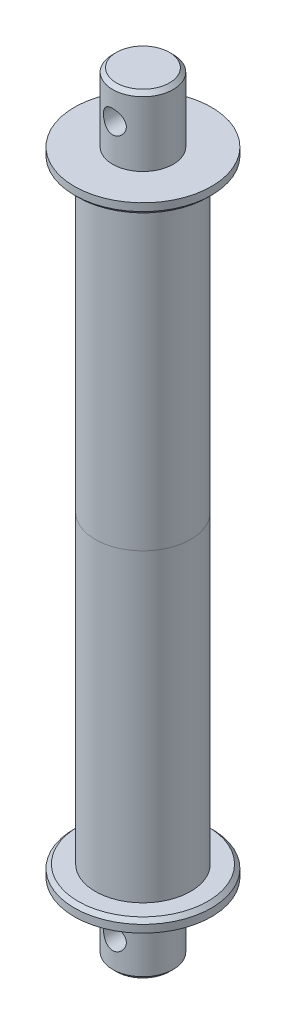
ISO-10303-21;
HEADER;
FILE_DESCRIPTION(('STEP AP214'),'2;1');
FILE_NAME('part.step','',(''),(''),'','','');
FILE_SCHEMA(('AUTOMOTIVE_DESIGN { 1 0 10303 214 1 1 1 1 }'));
ENDSEC;
DATA;
#1=APPLICATION_CONTEXT('core data for automotive mechanical design processes');
#2=APPLICATION_PROTOCOL_DEFINITION('international standard','automotive_design',2000,#1);
#3=PRODUCT_CONTEXT('',#1,'mechanical');
#4=PRODUCT('Part','Part','',(#3));
#5=PRODUCT_RELATED_PRODUCT_CATEGORY('part','',(#4));
#6=PRODUCT_DEFINITION_FORMATION('','',#4);
#7=PRODUCT_DEFINITION_CONTEXT('part definition',#1,'design');
#8=PRODUCT_DEFINITION('design','',#6,#7);
#9=PRODUCT_DEFINITION_SHAPE('','',#8);
#10=(LENGTH_UNIT() NAMED_UNIT(*) SI_UNIT(.MILLI.,.METRE.));
#11=(NAMED_UNIT(*) PLANE_ANGLE_UNIT() SI_UNIT($,.RADIAN.));
#12=(NAMED_UNIT(*) SI_UNIT($,.STERADIAN.) SOLID_ANGLE_UNIT());
#13=UNCERTAINTY_MEASURE_WITH_UNIT(LENGTH_MEASURE(1.E-05),#10,'distance_accuracy_value','');
#14=(GEOMETRIC_REPRESENTATION_CONTEXT(3) GLOBAL_UNCERTAINTY_ASSIGNED_CONTEXT((#13)) GLOBAL_UNIT_ASSIGNED_CONTEXT((#10,
#11,#12)) REPRESENTATION_CONTEXT('',''));
#15=CARTESIAN_POINT('',(0.,0.,0.));
#16=DIRECTION('',(0.,0.,1.));
#17=DIRECTION('',(1.,0.,0.));
#18=AXIS2_PLACEMENT_3D('',#15,#16,#17);
#19=CARTESIAN_POINT('',(0.,-184.,0.));
#20=DIRECTION('',(0.,1.,0.));
#21=DIRECTION('',(0.,0.,-1.));
#22=AXIS2_PLACEMENT_3D('',#19,#20,#21);
#23=CYLINDRICAL_SURFACE('',#22,7.95);
#24=CARTESIAN_POINT('',(0.,-178.7,-7.95));
#25=CARTESIAN_POINT('',(-0.162397491346748,-178.700006155822,-7.95000463305476));
#26=CARTESIAN_POINT('',(-0.324753099848184,-178.686772434708,-7.94498084128038));
#27=CARTESIAN_POINT('',(-0.644608276496747,-178.634404688573,-7.92544254710234));
#28=CARTESIAN_POINT('',(-0.802108607238702,-178.595274752861,-7.91092954315817));
#29=CARTESIAN_POINT('',(-1.10759384707584,-178.49269822242,-7.87396945860854));
#30=CARTESIAN_POINT('',(-1.25559660387505,-178.429298895846,-7.85153780728387));
#31=CARTESIAN_POINT('',(-1.53885384506537,-178.280225253955,-7.80097147100144));
#32=CARTESIAN_POINT('',(-1.67410485143574,-178.194544885329,-7.77283523668182));
#33=CARTESIAN_POINT('',(-1.93382546780256,-177.999501100852,-7.71241146666441));
#34=CARTESIAN_POINT('',(-2.05767538384718,-177.889349562112,-7.68000542519286));
#35=CARTESIAN_POINT('',(-2.28564512635347,-177.650163326245,-7.61527381268037));
#36=CARTESIAN_POINT('',(-2.38975880250598,-177.521122764952,-7.58294826981162));
#37=CARTESIAN_POINT('',(-2.57926636225751,-177.241737456099,-7.52065411531348));
#38=CARTESIAN_POINT('',(-2.6637805831916,-177.09076180509,-7.49082499932832));
#39=CARTESIAN_POINT('',(-2.80594178602416,-176.775437138237,-7.43874757327125));
#40=CARTESIAN_POINT('',(-2.86359965340992,-176.611093572494,-7.41649619275682));
#41=CARTESIAN_POINT('',(-2.94795796885628,-176.280834869077,-7.38336190811873));
#42=CARTESIAN_POINT('',(-2.97584212262489,-176.115266990026,-7.37204616258461));
#43=CARTESIAN_POINT('',(-3.00356228598173,-175.781445139854,-7.36079887492185));
#44=CARTESIAN_POINT('',(-3.00341006762253,-175.613192325772,-7.36086255474267));
#45=CARTESIAN_POINT('',(-2.97596618835097,-175.289655995893,-7.37199408836324));
#46=CARTESIAN_POINT('',(-2.95032311907401,-175.134205352635,-7.38239348387374));
#47=CARTESIAN_POINT('',(-2.87535300460385,-174.830002982662,-7.41191277552078));
#48=CARTESIAN_POINT('',(-2.82602234656689,-174.681252281612,-7.43103400189338));
#49=CARTESIAN_POINT('',(-2.70418189216197,-174.391334929297,-7.47624078591974));
#50=CARTESIAN_POINT('',(-2.6312480533409,-174.250366973954,-7.50245218680417));
#51=CARTESIAN_POINT('',(-2.4645673406646,-173.982194710485,-7.55884475137268));
#52=CARTESIAN_POINT('',(-2.37081321733859,-173.854995219441,-7.58902729628462));
#53=CARTESIAN_POINT('',(-2.15763402761746,-173.608854436917,-7.65246921492573));
#54=CARTESIAN_POINT('',(-2.03689525756286,-173.491066040375,-7.68579812115875));
#55=CARTESIAN_POINT('',(-1.77699753283556,-173.277063734313,-7.75001160096118));
#56=CARTESIAN_POINT('',(-1.63783568074396,-173.180853224796,-7.7808957888236));
#57=CARTESIAN_POINT('',(-1.34207116187379,-173.011444609312,-7.8373678710877));
#58=CARTESIAN_POINT('',(-1.18522721144045,-172.938635034876,-7.86286415320891));
#59=CARTESIAN_POINT('',(-0.860314702000954,-172.820819042114,-7.90500692503181));
#60=CARTESIAN_POINT('',(-0.692251231753703,-172.775800112654,-7.92165739657785));
#61=CARTESIAN_POINT('',(-0.359369733398544,-172.717070324382,-7.94353018166807));
#62=CARTESIAN_POINT('',(-0.19486250407749,-172.701807263327,-7.94931845634064));
#63=CARTESIAN_POINT('',(0.134445660228265,-172.698496926765,-7.95056675753456));
#64=CARTESIAN_POINT('',(0.299246520773489,-172.710443526443,-7.94602910839152));
#65=CARTESIAN_POINT('',(0.617726140759182,-172.760037038119,-7.92750856979343));
#66=CARTESIAN_POINT('',(0.771587980773985,-172.796663171383,-7.91390105530444));
#67=CARTESIAN_POINT('',(1.07087124221814,-172.893227896694,-7.87898797802321));
#68=CARTESIAN_POINT('',(1.21629156356081,-172.95316951938,-7.85768141450416));
#69=CARTESIAN_POINT('',(1.49937620417867,-173.096580931644,-7.8086891601555));
#70=CARTESIAN_POINT('',(1.63668485220482,-173.180693025988,-7.78083372768986));
#71=CARTESIAN_POINT('',(1.89570132393104,-173.369332962027,-7.7218192041405));
#72=CARTESIAN_POINT('',(2.01740330922294,-173.473868407347,-7.6906588846264));
#73=CARTESIAN_POINT('',(2.24923419609775,-173.707613859159,-7.62618977395529));
#74=CARTESIAN_POINT('',(2.35826281750801,-173.837912828914,-7.59286232939511));
#75=CARTESIAN_POINT('',(2.55312943709525,-174.115606919993,-7.52957881379437));
#76=CARTESIAN_POINT('',(2.6389652099205,-174.263003679909,-7.49962306642862));
#77=CARTESIAN_POINT('',(2.78513438407436,-174.572012098932,-7.44658528316189));
#78=CARTESIAN_POINT('',(2.84534845350868,-174.733686127761,-7.42353555585955));
#79=CARTESIAN_POINT('',(2.93729581964043,-175.065993510236,-7.38764350420071));
#80=CARTESIAN_POINT('',(2.96904704082561,-175.236621153564,-7.374794756358));
#81=CARTESIAN_POINT('',(3.00155503802499,-175.570053021797,-7.36161978142478));
#82=CARTESIAN_POINT('',(3.00419110375903,-175.7326455082,-7.36053436127972));
#83=CARTESIAN_POINT('',(2.98321973734043,-176.055827684246,-7.36905868877782));
#84=CARTESIAN_POINT('',(2.95961485946022,-176.216417567282,-7.37866739546335));
#85=CARTESIAN_POINT('',(2.88830176573362,-176.525929360605,-7.40686184253781));
#86=CARTESIAN_POINT('',(2.84137107510191,-176.675059147944,-7.42515720122094));
#87=CARTESIAN_POINT('',(2.72542723369111,-176.963412785519,-7.46849099490141));
#88=CARTESIAN_POINT('',(2.65640846747208,-177.102634105717,-7.49353114436682));
#89=CARTESIAN_POINT('',(2.4940127469099,-177.375226883347,-7.54918066261999));
#90=CARTESIAN_POINT('',(2.39954048534419,-177.50789940309,-7.58001455370614));
#91=CARTESIAN_POINT('',(2.19060617827199,-177.756108052509,-7.64301253026733));
#92=CARTESIAN_POINT('',(2.07613773887329,-177.871638679047,-7.67517703869663));
#93=CARTESIAN_POINT('',(1.82292686694646,-178.088775029515,-7.73934015838431));
#94=CARTESIAN_POINT('',(1.68319475235041,-178.189263396522,-7.7712320684291));
#95=CARTESIAN_POINT('',(1.38770505428976,-178.365304905216,-7.82939530273651));
#96=CARTESIAN_POINT('',(1.23194587961074,-178.440855567874,-7.85566606811619));
#97=CARTESIAN_POINT('',(0.900729443719504,-178.567331659402,-7.90065816243918));
#98=CARTESIAN_POINT('',(0.724682578706468,-178.616880634104,-7.91895015266806));
#99=CARTESIAN_POINT('',(0.365737044740326,-178.683202847218,-7.94361537532247));
#100=CARTESIAN_POINT('',(0.182841976353431,-178.699993069211,-7.94999478368242));
#101=CARTESIAN_POINT('',(0.,-178.7,-7.95));
#102=B_SPLINE_CURVE_WITH_KNOTS('',3,(#24,#25,#26,#27,#28,#29,#30,#31,#32,#33,#34,#35,#36,#37,
#38,#39,#40,#41,#42,#43,#44,#45,#46,#47,#48,#49,#50,#51,#52,#53,#54,#55,#56,#57,#58,#59,#60,#61,
#62,#63,#64,#65,#66,#67,#68,#69,#70,#71,#72,#73,#74,#75,#76,#77,#78,#79,#80,#81,#82,#83,#84,#85,
#86,#87,#88,#89,#90,#91,#92,#93,#94,#95,#96,#97,#98,#99,#100,#101),.UNSPECIFIED.,.T.,.F.,(4,2,2,
2,2,2,2,2,2,2,2,2,2,2,2,2,2,2,2,2,2,2,2,2,2,2,2,2,2,2,2,2,2,2,2,2,2,2,4),(0.,0.486517984474757,
0.972959160520784,1.45845770295972,1.94408828362444,2.44851024997545,2.95308914942897,
3.47718162143793,4.00106148167018,4.503234870572,5.00519740487303,5.47667849204094,
5.94823151260984,6.42877607760177,6.90948822777714,7.42294833461539,7.93648929004924,
8.45816227693259,8.97960023906362,9.4730216283662,9.96633196092749,10.4403977118492,
10.9145251042877,11.4026484582173,11.8909538882842,12.4079529144854,12.9250015290952,
13.4444325927827,13.9635363143255,14.4489214843418,14.9342594114916,15.4044069203738,
15.8746740496895,16.36981560475,16.8651157749309,17.3876947690209,17.9103256964684,
18.4583764326353,19.0061429595389),.UNSPECIFIED.);
#103=CARTESIAN_POINT('',(0.,-178.7,-7.95));
#104=VERTEX_POINT('',#103);
#105=EDGE_CURVE('E77',#104,#104,#102,.T.);
#106=ORIENTED_EDGE('',*,*,#105,.F.);
#107=EDGE_LOOP('',(#106));
#108=FACE_BOUND('',#107,.T.);
#109=CARTESIAN_POINT('',(3.,-175.7,7.36223471508482));
#110=CARTESIAN_POINT('',(2.99998847638603,-175.538180879128,7.36224526269351));
#111=CARTESIAN_POINT('',(2.9868408533845,-175.376210372287,7.36763957602915));
#112=CARTESIAN_POINT('',(2.93479898105657,-175.057258889964,7.38851783959743));
#113=CARTESIAN_POINT('',(2.89590575612689,-174.90027771622,7.40400138838714));
#114=CARTESIAN_POINT('',(2.79402781177854,-174.595869307248,7.44304061076884));
#115=CARTESIAN_POINT('',(2.731101471071,-174.448419925345,7.46657670963436));
#116=CARTESIAN_POINT('',(2.58314510981222,-174.166120814064,7.51904250584224));
#117=CARTESIAN_POINT('',(2.49810836153358,-174.031274936674,7.54797384408236));
#118=CARTESIAN_POINT('',(2.30376153242717,-173.77121232088,7.60960064181843));
#119=CARTESIAN_POINT('',(2.19351841745457,-173.646719044522,7.64240778971229));
#120=CARTESIAN_POINT('',(1.95386685111475,-173.417477058005,7.70715883050975));
#121=CARTESIAN_POINT('',(1.82445425584252,-173.31273262815,7.73910253499114));
#122=CARTESIAN_POINT('',(1.5446329927432,-173.122462950205,7.79985728918744));
#123=CARTESIAN_POINT('',(1.39365377203541,-173.037725922019,7.82852214322748));
#124=CARTESIAN_POINT('',(1.07830992462712,-172.895154589421,7.87814508841391));
#125=CARTESIAN_POINT('',(0.913950027301736,-172.837310827727,7.89910588822244));
#126=CARTESIAN_POINT('',(0.584118525776005,-172.752710834085,7.93016590252776));
#127=CARTESIAN_POINT('',(0.419008191449069,-172.724708541218,7.9406990457691));
#128=CARTESIAN_POINT('',(0.0861182550130899,-172.696591994262,7.9512752587645));
#129=CARTESIAN_POINT('',(-0.0816604499755085,-172.696468557408,7.95132178261133));
#130=CARTESIAN_POINT('',(-0.406186165059412,-172.723391510091,7.94119442034515));
#131=CARTESIAN_POINT('',(-0.563064807507877,-172.749077333313,7.93153233504782));
#132=CARTESIAN_POINT('',(-0.870095460195533,-172.824598641354,7.90374636952053));
#133=CARTESIAN_POINT('',(-1.02024699260719,-172.874435838686,7.88562188924655));
#134=CARTESIAN_POINT('',(-1.31216781002694,-172.997468038824,7.84237373573117));
#135=CARTESIAN_POINT('',(-1.45378254871369,-173.070993715385,7.81715165701678));
#136=CARTESIAN_POINT('',(-1.72301698371786,-173.239021535831,7.76225605799518));
#137=CARTESIAN_POINT('',(-1.85063211474019,-173.333530492197,7.73258109302015));
#138=CARTESIAN_POINT('',(-2.0962529116849,-173.547378261552,7.66976135047149));
#139=CARTESIAN_POINT('',(-2.2132430127343,-173.667855472786,7.63651515908536));
#140=CARTESIAN_POINT('',(-2.42574456827632,-173.92691204718,7.57169953695764));
#141=CARTESIAN_POINT('',(-2.52125048739725,-174.065496061028,7.54013053993966));
#142=CARTESIAN_POINT('',(-2.69004722792075,-174.360888297443,7.48159976832992));
#143=CARTESIAN_POINT('',(-2.76278393320141,-174.518039077203,7.45475898596922));
#144=CARTESIAN_POINT('',(-2.880375100483,-174.843639024047,7.41012433225883));
#145=CARTESIAN_POINT('',(-2.92524531348823,-175.012081748807,7.39232535124068));
#146=CARTESIAN_POINT('',(-2.98350497294114,-175.345438628219,7.36899818161272));
#147=CARTESIAN_POINT('',(-2.99850974291805,-175.510026125528,7.36284132147711));
#148=CARTESIAN_POINT('',(-3.0012775017635,-175.83944639009,7.36171480133552));
#149=CARTESIAN_POINT('',(-2.98904742268387,-176.004279084261,7.36674229458981));
#150=CARTESIAN_POINT('',(-2.93915784101862,-176.321162955007,7.38677890427645));
#151=CARTESIAN_POINT('',(-2.90275536170076,-176.473446912731,7.40129408111522));
#152=CARTESIAN_POINT('',(-2.80714040331809,-176.76967282233,7.43808226609779));
#153=CARTESIAN_POINT('',(-2.74792321527995,-176.91361304499,7.46035687570344));
#154=CARTESIAN_POINT('',(-2.60584361626127,-177.195116424026,7.51118902933163));
#155=CARTESIAN_POINT('',(-2.5221722334124,-177.33223304491,7.53995219207521));
#156=CARTESIAN_POINT('',(-2.33441687648242,-177.591052670267,7.6001779991562));
#157=CARTESIAN_POINT('',(-2.23032535035139,-177.712749944663,7.63164163979143));
#158=CARTESIAN_POINT('',(-1.99676156560833,-177.945399927448,7.69616935064396));
#159=CARTESIAN_POINT('',(-1.86608723424951,-178.055157597863,7.72920614910852));
#160=CARTESIAN_POINT('',(-1.58736643616049,-178.251333790744,7.79122096312534));
#161=CARTESIAN_POINT('',(-1.43931986006059,-178.337752166263,7.82019895312222));
#162=CARTESIAN_POINT('',(-1.13009967886562,-178.484247799443,7.87082025135715));
#163=CARTESIAN_POINT('',(-0.96896965101651,-178.544408564079,7.89248676165433));
#164=CARTESIAN_POINT('',(-0.637870931627834,-178.636427307437,7.9261118932038));
#165=CARTESIAN_POINT('',(-0.467906493780561,-178.668298776001,7.9380751412537));
#166=CARTESIAN_POINT('',(-0.134758318572022,-178.7013659427,7.95050234819133));
#167=CARTESIAN_POINT('',(0.0282347182748405,-178.704258772006,7.95160244842512));
#168=CARTESIAN_POINT('',(0.352286714056233,-178.683662690532,7.94384354853882));
#169=CARTESIAN_POINT('',(0.51334590878408,-178.660177029784,7.93498577530464));
#170=CARTESIAN_POINT('',(0.824872903926979,-178.588684897764,7.90859918182994));
#171=CARTESIAN_POINT('',(0.975504704927173,-178.541304891379,7.89129223621013));
#172=CARTESIAN_POINT('',(1.26668938334082,-178.42399525107,7.84981845145298));
#173=CARTESIAN_POINT('',(1.407240345928,-178.35406134689,7.82565031335174));
#174=CARTESIAN_POINT('',(1.68078304743255,-178.190271019917,7.77159770902848));
#175=CARTESIAN_POINT('',(1.81320405662408,-178.095528280633,7.74151478259925));
#176=CARTESIAN_POINT('',(2.06079145832987,-177.886191784806,7.67932043381079));
#177=CARTESIAN_POINT('',(2.17595163342778,-177.771590907182,7.64720828641126));
#178=CARTESIAN_POINT('',(2.39209703979936,-177.51852576982,7.58246561904029));
#179=CARTESIAN_POINT('',(2.49199147751535,-177.379111604076,7.54989958951667));
#180=CARTESIAN_POINT('',(2.66701047282742,-177.084333982466,7.48987098387787));
#181=CARTESIAN_POINT('',(2.74213185351583,-176.92896848434,7.46240906251267));
#182=CARTESIAN_POINT('',(2.83572851156726,-176.683296007016,7.427133469645));
#183=CARTESIAN_POINT('',(2.86416654860317,-176.597111817032,7.41618073356408));
#184=CARTESIAN_POINT('',(2.91317517775546,-176.422246879659,7.39706747795765));
#185=CARTESIAN_POINT('',(2.93374932570496,-176.333567280146,7.38890569661591));
#186=CARTESIAN_POINT('',(2.96676758310502,-176.154504505493,7.37571079709818));
#187=CARTESIAN_POINT('',(2.97921437058769,-176.064121901617,7.37067664836808));
#188=CARTESIAN_POINT('',(2.99583331277785,-175.882508849827,7.36393584017285));
#189=CARTESIAN_POINT('',(3.00000650021022,-175.791278509158,7.36222876541712));
#190=CARTESIAN_POINT('',(3.,-175.7,7.36223471508482));
#191=B_SPLINE_CURVE_WITH_KNOTS('',3,(#109,#110,#111,#112,#113,#114,#115,#116,#117,#118,#119,
#120,#121,#122,#123,#124,#125,#126,#127,#128,#129,#130,#131,#132,#133,#134,#135,#136,#137,#138,
#139,#140,#141,#142,#143,#144,#145,#146,#147,#148,#149,#150,#151,#152,#153,#154,#155,#156,#157,
#158,#159,#160,#161,#162,#163,#164,#165,#166,#167,#168,#169,#170,#171,#172,#173,#174,#175,#176,
#177,#178,#179,#180,#181,#182,#183,#184,#185,#186,#187,#188,#189,#190),.UNSPECIFIED.,.T.,.F.,(4,
2,2,2,2,2,2,2,2,2,2,2,2,2,2,2,2,2,2,2,2,2,2,2,2,2,2,2,2,2,2,2,2,2,2,2,2,2,2,2,4),(0.,
0.485113019093975,0.970206737092248,1.45412953481372,1.93819975263344,2.44443134249792,
2.95077252559746,3.47459178516767,3.99822669897873,4.49901899995725,4.99964634924537,
5.47519839146571,5.95078415883132,6.43331940839044,6.91601154864105,7.42726811632731,
7.93865625811923,8.46166485432306,8.98437756017793,9.47795435847513,9.9714055416508,
10.4410183842214,10.9107282072142,11.3981880218202,11.885828456347,12.4048427572537,
12.9238603258718,13.4412150191416,13.9583228773832,14.444955850278,14.9315288728514,
15.4059609368032,15.8804828804031,16.3750646117023,16.8698240672408,17.3911057262614,
17.9124542086976,18.1863439084664,18.4601096159645,18.7337850698281,19.0074263609033),.UNSPECIFIED.);
#192=CARTESIAN_POINT('',(3.,-175.7,7.36223471508482));
#193=VERTEX_POINT('',#192);
#194=EDGE_CURVE('E69',#193,#193,#191,.T.);
#195=ORIENTED_EDGE('',*,*,#194,.F.);
#196=EDGE_LOOP('',(#195));
#197=FACE_BOUND('',#196,.T.);
#198=CARTESIAN_POINT('',(0.,-183.,0.));
#199=DIRECTION('',(0.,1.,0.));
#200=DIRECTION('',(0.,0.,1.));
#201=AXIS2_PLACEMENT_3D('',#198,#199,#200);
#202=CIRCLE('',#201,7.95);
#203=CARTESIAN_POINT('',(0.,-183.,7.95));
#204=VERTEX_POINT('',#203);
#205=EDGE_CURVE('E66',#204,#204,#202,.F.);
#206=ORIENTED_EDGE('',*,*,#205,.F.);
#207=EDGE_LOOP('',(#206));
#208=FACE_BOUND('',#207,.T.);
#209=CARTESIAN_POINT('',(0.,-166.,0.));
#210=DIRECTION('',(0.,1.,0.));
#211=DIRECTION('',(0.,0.,1.));
#212=AXIS2_PLACEMENT_3D('',#209,#210,#211);
#213=CIRCLE('',#212,7.95);
#214=CARTESIAN_POINT('',(0.,-166.,7.95));
#215=VERTEX_POINT('',#214);
#216=EDGE_CURVE('E60',#215,#215,#213,.T.);
#217=ORIENTED_EDGE('',*,*,#216,.F.);
#218=EDGE_LOOP('',(#217));
#219=FACE_BOUND('',#218,.T.);
#220=ADVANCED_FACE('F41',(#108,#197,#208,#219),#23,.T.);
#221=CARTESIAN_POINT('',(0.,-184.,0.));
#222=DIRECTION('',(0.,-1.,0.));
#223=DIRECTION('',(0.,0.,1.));
#224=AXIS2_PLACEMENT_3D('',#221,#222,#223);
#225=PLANE('',#224);
#226=CARTESIAN_POINT('',(0.,-184.,0.));
#227=DIRECTION('',(0.,1.,0.));
#228=DIRECTION('',(0.,0.,1.));
#229=AXIS2_PLACEMENT_3D('',#226,#227,#228);
#230=CIRCLE('',#229,6.95);
#231=CARTESIAN_POINT('',(0.,-184.,6.95));
#232=VERTEX_POINT('',#231);
#233=EDGE_CURVE('E63',#232,#232,#230,.T.);
#234=ORIENTED_EDGE('',*,*,#233,.F.);
#235=EDGE_LOOP('',(#234));
#236=FACE_BOUND('',#235,.T.);
#237=ADVANCED_FACE('F87',(#236),#225,.T.);
#238=CARTESIAN_POINT('',(0.,-184.,0.));
#239=DIRECTION('',(0.,1.,0.));
#240=DIRECTION('',(0.,0.,-1.));
#241=AXIS2_PLACEMENT_3D('',#238,#239,#240);
#242=CONICAL_SURFACE('',#241,6.95,0.785398163397444);
#243=ORIENTED_EDGE('',*,*,#205,.T.);
#244=EDGE_LOOP('',(#243));
#245=FACE_BOUND('',#244,.T.);
#246=ORIENTED_EDGE('',*,*,#233,.T.);
#247=EDGE_LOOP('',(#246));
#248=FACE_BOUND('',#247,.T.);
#249=ADVANCED_FACE('F89',(#245,#248),#242,.T.);
#250=CARTESIAN_POINT('',(0.,-175.7,-7.95));
#251=DIRECTION('',(0.,0.,1.));
#252=DIRECTION('',(1.,0.,0.));
#253=AXIS2_PLACEMENT_3D('',#250,#251,#252);
#254=CYLINDRICAL_SURFACE('',#253,3.);
#255=ORIENTED_EDGE('',*,*,#194,.T.);
#256=EDGE_LOOP('',(#255));
#257=FACE_BOUND('',#256,.T.);
#258=ORIENTED_EDGE('',*,*,#105,.T.);
#259=EDGE_LOOP('',(#258));
#260=FACE_BOUND('',#259,.T.);
#261=ADVANCED_FACE('F81',(#257,#260),#254,.F.);
#262=CARTESIAN_POINT('',(0.,-163.,0.));
#263=DIRECTION('',(0.,-1.,0.));
#264=DIRECTION('',(0.,0.,1.));
#265=AXIS2_PLACEMENT_3D('',#262,#263,#264);
#266=CYLINDRICAL_SURFACE('',#265,18.);
#267=CARTESIAN_POINT('',(0.,-164.,0.));
#268=DIRECTION('',(0.,1.,0.));
#269=DIRECTION('',(0.,0.,1.));
#270=AXIS2_PLACEMENT_3D('',#267,#268,#269);
#271=CIRCLE('',#270,18.);
#272=CARTESIAN_POINT('',(0.,-164.,18.));
#273=VERTEX_POINT('',#272);
#274=EDGE_CURVE('E53',#273,#273,#271,.T.);
#275=ORIENTED_EDGE('',*,*,#274,.F.);
#276=EDGE_LOOP('',(#275));
#277=FACE_BOUND('',#276,.T.);
#278=CARTESIAN_POINT('',(0.,-166.,0.));
#279=DIRECTION('',(0.,1.,0.));
#280=DIRECTION('',(0.,0.,1.));
#281=AXIS2_PLACEMENT_3D('',#278,#279,#280);
#282=CIRCLE('',#281,18.);
#283=CARTESIAN_POINT('',(0.,-166.,18.));
#284=VERTEX_POINT('',#283);
#285=EDGE_CURVE('E57',#284,#284,#282,.T.);
#286=ORIENTED_EDGE('',*,*,#285,.T.);
#287=EDGE_LOOP('',(#286));
#288=FACE_BOUND('',#287,.T.);
#289=ADVANCED_FACE('F97',(#277,#288),#266,.T.);
#290=CARTESIAN_POINT('',(0.,-163.,0.));
#291=DIRECTION('',(0.,-1.,0.));
#292=DIRECTION('',(0.,0.,1.));
#293=AXIS2_PLACEMENT_3D('',#290,#291,#292);
#294=PLANE('',#293);
#295=CARTESIAN_POINT('',(0.,-163.,0.));
#296=DIRECTION('',(0.,-1.,0.));
#297=DIRECTION('',(0.,0.,-1.));
#298=AXIS2_PLACEMENT_3D('',#295,#296,#297);
#299=CIRCLE('',#298,12.5);
#300=CARTESIAN_POINT('',(0.,-163.,-12.5));
#301=VERTEX_POINT('',#300);
#302=EDGE_CURVE('E11',#301,#301,#299,.T.);
#303=ORIENTED_EDGE('',*,*,#302,.T.);
#304=EDGE_LOOP('',(#303));
#305=FACE_BOUND('',#304,.T.);
#306=CARTESIAN_POINT('',(0.,-163.,0.));
#307=DIRECTION('',(0.,1.,0.));
#308=DIRECTION('',(0.,0.,1.));
#309=AXIS2_PLACEMENT_3D('',#306,#307,#308);
#310=CIRCLE('',#309,17.);
#311=CARTESIAN_POINT('',(0.,-163.,17.));
#312=VERTEX_POINT('',#311);
#313=EDGE_CURVE('E45',#312,#312,#310,.F.);
#314=ORIENTED_EDGE('',*,*,#313,.F.);
#315=EDGE_LOOP('',(#314));
#316=FACE_BOUND('',#315,.T.);
#317=ADVANCED_FACE('F110',(#305,#316),#294,.F.);
#318=CARTESIAN_POINT('',(0.,-166.,0.));
#319=DIRECTION('',(0.,-1.,0.));
#320=DIRECTION('',(0.,0.,1.));
#321=AXIS2_PLACEMENT_3D('',#318,#319,#320);
#322=PLANE('',#321);
#323=ORIENTED_EDGE('',*,*,#216,.T.);
#324=EDGE_LOOP('',(#323));
#325=FACE_BOUND('',#324,.T.);
#326=ORIENTED_EDGE('',*,*,#285,.F.);
#327=EDGE_LOOP('',(#326));
#328=FACE_BOUND('',#327,.T.);
#329=ADVANCED_FACE('F107',(#325,#328),#322,.T.);
#330=CARTESIAN_POINT('',(0.,-164.,0.));
#331=DIRECTION('',(0.,-1.,0.));
#332=DIRECTION('',(0.,0.,1.));
#333=AXIS2_PLACEMENT_3D('',#330,#331,#332);
#334=CONICAL_SURFACE('',#333,18.,0.78539816339745);
#335=ORIENTED_EDGE('',*,*,#313,.T.);
#336=EDGE_LOOP('',(#335));
#337=FACE_BOUND('',#336,.T.);
#338=ORIENTED_EDGE('',*,*,#274,.T.);
#339=EDGE_LOOP('',(#338));
#340=FACE_BOUND('',#339,.T.);
#341=ADVANCED_FACE('F43',(#337,#340),#334,.T.);
#342=CARTESIAN_POINT('',(0.,-83.,0.));
#343=DIRECTION('',(0.,-1.,0.));
#344=DIRECTION('',(0.,0.,1.));
#345=AXIS2_PLACEMENT_3D('',#342,#343,#344);
#346=CYLINDRICAL_SURFACE('',#345,12.5);
#347=CARTESIAN_POINT('',(0.,-83.,0.));
#348=DIRECTION('',(0.,-1.,0.));
#349=DIRECTION('',(0.,0.,-1.));
#350=AXIS2_PLACEMENT_3D('',#347,#348,#349);
#351=CIRCLE('',#350,12.5);
#352=CARTESIAN_POINT('',(0.,-83.,-12.5));
#353=VERTEX_POINT('',#352);
#354=EDGE_CURVE('E56',#353,#353,#351,.T.);
#355=ORIENTED_EDGE('',*,*,#354,.T.);
#356=EDGE_LOOP('',(#355));
#357=FACE_BOUND('',#356,.T.);
#358=ORIENTED_EDGE('',*,*,#302,.F.);
#359=EDGE_LOOP('',(#358));
#360=FACE_BOUND('',#359,.T.);
#361=ADVANCED_FACE('F122',(#357,#360),#346,.T.);
#362=CARTESIAN_POINT('',(0.,-83.,0.));
#363=DIRECTION('',(0.,1.,0.));
#364=DIRECTION('',(0.,0.,-1.));
#365=AXIS2_PLACEMENT_3D('',#362,#363,#364);
#366=PLANE('',#365);
#367=ORIENTED_EDGE('',*,*,#354,.F.);
#368=EDGE_LOOP('',(#367));
#369=FACE_BOUND('',#368,.T.);
#370=ADVANCED_FACE('F125',(#369),#366,.T.);
#371=CLOSED_SHELL('',(#220,#237,#249,#261,#289,#317,#329,#341,#361,#370));
#372=MANIFOLD_SOLID_BREP('B2',#371);
#373=CARTESIAN_POINT('',(0.,18.,0.));
#374=DIRECTION('',(0.,-1.,0.));
#375=DIRECTION('',(0.,0.,-1.));
#376=AXIS2_PLACEMENT_3D('',#373,#374,#375);
#377=CYLINDRICAL_SURFACE('',#376,7.95);
#378=CARTESIAN_POINT('',(0.,12.7,-7.95));
#379=CARTESIAN_POINT('',(-0.162397491346748,12.7000061558222,-7.95000463305476));
#380=CARTESIAN_POINT('',(-0.324753099848184,12.686772434708,-7.94498084128038));
#381=CARTESIAN_POINT('',(-0.644608276496746,12.6344046885734,-7.92544254710234));
#382=CARTESIAN_POINT('',(-0.802108607238702,12.5952747528614,-7.91092954315817));
#383=CARTESIAN_POINT('',(-1.10759384707584,12.4926982224202,-7.87396945860854));
#384=CARTESIAN_POINT('',(-1.25559660387506,12.4292988958457,-7.85153780728387));
#385=CARTESIAN_POINT('',(-1.53885384506537,12.2802252539554,-7.80097147100144));
#386=CARTESIAN_POINT('',(-1.67410485143574,12.1945448853293,-7.77283523668182));
#387=CARTESIAN_POINT('',(-1.93382546780257,11.9995011008524,-7.71241146666441));
#388=CARTESIAN_POINT('',(-2.05767538384719,11.8893495621118,-7.68000542519286));
#389=CARTESIAN_POINT('',(-2.28564512635348,11.6501633262448,-7.61527381268037));
#390=CARTESIAN_POINT('',(-2.38975880250598,11.5211227649516,-7.58294826981162));
#391=CARTESIAN_POINT('',(-2.57926636225751,11.2417374560993,-7.52065411531348));
#392=CARTESIAN_POINT('',(-2.6637805831916,11.0907618050901,-7.49082499932832));
#393=CARTESIAN_POINT('',(-2.80594178602416,10.7754371382371,-7.43874757327125));
#394=CARTESIAN_POINT('',(-2.86359965340992,10.611093572494,-7.41649619275682));
#395=CARTESIAN_POINT('',(-2.94795796885627,10.2808348690774,-7.38336190811873));
#396=CARTESIAN_POINT('',(-2.97584212262488,10.115266990026,-7.37204616258461));
#397=CARTESIAN_POINT('',(-3.00356228598173,9.7814451398545,-7.36079887492185));
#398=CARTESIAN_POINT('',(-3.00341006762254,9.61319232577162,-7.36086255474267));
#399=CARTESIAN_POINT('',(-2.97596618835097,9.28965599589298,-7.37199408836324));
#400=CARTESIAN_POINT('',(-2.950323119074,9.13420535263497,-7.38239348387374));
#401=CARTESIAN_POINT('',(-2.87535300460385,8.83000298266155,-7.41191277552078));
#402=CARTESIAN_POINT('',(-2.8260223465669,8.68125228161165,-7.43103400189338));
#403=CARTESIAN_POINT('',(-2.70418189216197,8.39133492929746,-7.47624078591974));
#404=CARTESIAN_POINT('',(-2.6312480533409,8.2503669739539,-7.50245218680417));
#405=CARTESIAN_POINT('',(-2.46456734066459,7.98219471048518,-7.55884475137268));
#406=CARTESIAN_POINT('',(-2.3708132173386,7.8549952194409,-7.58902729628462));
#407=CARTESIAN_POINT('',(-2.15763402761747,7.60885443691731,-7.65246921492573));
#408=CARTESIAN_POINT('',(-2.03689525756286,7.49106604037545,-7.68579812115875));
#409=CARTESIAN_POINT('',(-1.77699753283556,7.27706373431274,-7.75001160096118));
#410=CARTESIAN_POINT('',(-1.63783568074396,7.18085322479597,-7.78089578882361));
#411=CARTESIAN_POINT('',(-1.34207116187379,7.01144460931163,-7.8373678710877));
#412=CARTESIAN_POINT('',(-1.18522721144044,6.93863503487575,-7.86286415320891));
#413=CARTESIAN_POINT('',(-0.86031470200094,6.82081904211372,-7.90500692503182));
#414=CARTESIAN_POINT('',(-0.692251231753698,6.77580011265377,-7.92165739657785));
#415=CARTESIAN_POINT('',(-0.359369733398546,6.71707032438193,-7.94353018166807));
#416=CARTESIAN_POINT('',(-0.19486250407749,6.70180726332692,-7.94931845634064));
#417=CARTESIAN_POINT('',(0.134445660228267,6.69849692676496,-7.95056675753456));
#418=CARTESIAN_POINT('',(0.299246520773491,6.71044352644258,-7.94602910839152));
#419=CARTESIAN_POINT('',(0.617726140759181,6.76003703811891,-7.92750856979343));
#420=CARTESIAN_POINT('',(0.771587980773982,6.79666317138276,-7.91390105530444));
#421=CARTESIAN_POINT('',(1.07087124221814,6.89322789669408,-7.87898797802321));
#422=CARTESIAN_POINT('',(1.21629156356081,6.95316951937971,-7.85768141450416));
#423=CARTESIAN_POINT('',(1.49937620417867,7.09658093164373,-7.8086891601555));
#424=CARTESIAN_POINT('',(1.63668485220481,7.18069302598826,-7.78083372768987));
#425=CARTESIAN_POINT('',(1.89570132393103,7.36933296202654,-7.7218192041405));
#426=CARTESIAN_POINT('',(2.01740330922294,7.47386840734707,-7.6906588846264));
#427=CARTESIAN_POINT('',(2.24923419609776,7.70761385915857,-7.62618977395529));
#428=CARTESIAN_POINT('',(2.35826281750802,7.83791282891418,-7.59286232939511));
#429=CARTESIAN_POINT('',(2.55312943709526,8.1156069199928,-7.52957881379437));
#430=CARTESIAN_POINT('',(2.63896520992051,8.26300367990923,-7.49962306642862));
#431=CARTESIAN_POINT('',(2.78513438407435,8.57201209893149,-7.44658528316189));
#432=CARTESIAN_POINT('',(2.84534845350868,8.733686127761,-7.42353555585956));
#433=CARTESIAN_POINT('',(2.93729581964043,9.06599351023611,-7.38764350420071));
#434=CARTESIAN_POINT('',(2.96904704082561,9.23662115356447,-7.374794756358));
#435=CARTESIAN_POINT('',(3.00155503802499,9.57005302179686,-7.36161978142478));
#436=CARTESIAN_POINT('',(3.00419110375903,9.73264550820018,-7.36053436127972));
#437=CARTESIAN_POINT('',(2.98321973734044,10.0558276842463,-7.36905868877781));
#438=CARTESIAN_POINT('',(2.95961485946022,10.2164175672823,-7.37866739546335));
#439=CARTESIAN_POINT('',(2.88830176573362,10.5259293606051,-7.40686184253781));
#440=CARTESIAN_POINT('',(2.84137107510192,10.6750591479437,-7.42515720122094));
#441=CARTESIAN_POINT('',(2.72542723369112,10.963412785519,-7.46849099490141));
#442=CARTESIAN_POINT('',(2.65640846747208,11.1026341057172,-7.49353114436682));
#443=CARTESIAN_POINT('',(2.4940127469099,11.375226883347,-7.54918066261999));
#444=CARTESIAN_POINT('',(2.39954048534419,11.5078994030905,-7.58001455370614));
#445=CARTESIAN_POINT('',(2.19060617827199,11.7561080525092,-7.64301253026733));
#446=CARTESIAN_POINT('',(2.07613773887328,11.8716386790474,-7.67517703869663));
#447=CARTESIAN_POINT('',(1.82292686694646,12.0887750295145,-7.73934015838431));
#448=CARTESIAN_POINT('',(1.68319475235042,12.1892633965218,-7.7712320684291));
#449=CARTESIAN_POINT('',(1.38770505428977,12.365304905216,-7.82939530273651));
#450=CARTESIAN_POINT('',(1.23194587961074,12.4408555678737,-7.85566606811619));
#451=CARTESIAN_POINT('',(0.900729443719499,12.5673316594021,-7.90065816243918));
#452=CARTESIAN_POINT('',(0.72468257870646,12.6168806341044,-7.91895015266806));
#453=CARTESIAN_POINT('',(0.36573704474032,12.6832028472176,-7.94361537532247));
#454=CARTESIAN_POINT('',(0.182841976353428,12.6999930692113,-7.94999478368242));
#455=CARTESIAN_POINT('',(0.,12.7,-7.95));
#456=B_SPLINE_CURVE_WITH_KNOTS('',3,(#378,#379,#380,#381,#382,#383,#384,#385,#386,#387,#388,
#389,#390,#391,#392,#393,#394,#395,#396,#397,#398,#399,#400,#401,#402,#403,#404,#405,#406,#407,
#408,#409,#410,#411,#412,#413,#414,#415,#416,#417,#418,#419,#420,#421,#422,#423,#424,#425,#426,
#427,#428,#429,#430,#431,#432,#433,#434,#435,#436,#437,#438,#439,#440,#441,#442,#443,#444,#445,
#446,#447,#448,#449,#450,#451,#452,#453,#454,#455),.UNSPECIFIED.,.T.,.F.,(4,2,2,2,2,2,2,2,2,2,2,
2,2,2,2,2,2,2,2,2,2,2,2,2,2,2,2,2,2,2,2,2,2,2,2,2,2,2,4),(0.,0.486517984474757,
0.972959160520783,1.45845770295972,1.94408828362444,2.44851024997547,2.95308914942897,
3.47718162143792,4.00106148167018,4.50323487057201,5.00519740487303,5.47667849204093,
5.94823151260985,6.42877607760176,6.90948822777715,7.42294833461538,7.93648929004924,
8.45816227693261,8.97960023906363,9.4730216283662,9.96633196092749,10.4403977118492,
10.9145251042877,11.4026484582173,11.8909538882842,12.4079529144854,12.9250015290952,
13.4444325927827,13.9635363143255,14.4489214843418,14.9342594114916,15.4044069203738,
15.8746740496895,16.36981560475,16.8651157749309,17.3876947690209,17.9103256964684,
18.4583764326353,19.0061429595389),.UNSPECIFIED.);
#457=CARTESIAN_POINT('',(0.,12.7,-7.95));
#458=VERTEX_POINT('',#457);
#459=EDGE_CURVE('E240',#458,#458,#456,.T.);
#460=ORIENTED_EDGE('',*,*,#459,.T.);
#461=EDGE_LOOP('',(#460));
#462=FACE_BOUND('',#461,.T.);
#463=CARTESIAN_POINT('',(3.,9.7,7.36223471508482));
#464=CARTESIAN_POINT('',(2.99998847638603,9.53818087912798,7.36224526269351));
#465=CARTESIAN_POINT('',(2.9868408533845,9.3762103722872,7.36763957602915));
#466=CARTESIAN_POINT('',(2.93479898105657,9.05725888996367,7.38851783959744));
#467=CARTESIAN_POINT('',(2.89590575612689,8.90027771621983,7.40400138838714));
#468=CARTESIAN_POINT('',(2.79402781177854,8.59586930724842,7.44304061076884));
#469=CARTESIAN_POINT('',(2.731101471071,8.44841992534473,7.46657670963436));
#470=CARTESIAN_POINT('',(2.58314510981222,8.16612081406447,7.51904250584225));
#471=CARTESIAN_POINT('',(2.49810836153358,8.03127493667398,7.54797384408236));
#472=CARTESIAN_POINT('',(2.30376153242717,7.77121232087998,7.60960064181843));
#473=CARTESIAN_POINT('',(2.19351841745457,7.64671904452181,7.64240778971228));
#474=CARTESIAN_POINT('',(1.95386685111475,7.41747705800545,7.70715883050975));
#475=CARTESIAN_POINT('',(1.82445425584252,7.31273262815022,7.73910253499114));
#476=CARTESIAN_POINT('',(1.5446329927432,7.12246295020474,7.79985728918744));
#477=CARTESIAN_POINT('',(1.3936537720354,7.03772592201908,7.82852214322748));
#478=CARTESIAN_POINT('',(1.07830992462711,6.89515458942065,7.87814508841391));
#479=CARTESIAN_POINT('',(0.913950027301735,6.83731082772747,7.89910588822244));
#480=CARTESIAN_POINT('',(0.584118525776006,6.75271083408455,7.93016590252776));
#481=CARTESIAN_POINT('',(0.419008191449069,6.72470854121812,7.9406990457691));
#482=CARTESIAN_POINT('',(0.0861182550130894,6.69659199426228,7.9512752587645));
#483=CARTESIAN_POINT('',(-0.0816604499755095,6.69646855740847,7.95132178261133));
#484=CARTESIAN_POINT('',(-0.406186165059413,6.7233915100908,7.94119442034515));
#485=CARTESIAN_POINT('',(-0.563064807507878,6.74907733331319,7.93153233504782));
#486=CARTESIAN_POINT('',(-0.870095460195534,6.82459864135385,7.90374636952053));
#487=CARTESIAN_POINT('',(-1.02024699260719,6.87443583868587,7.88562188924655));
#488=CARTESIAN_POINT('',(-1.31216781002694,6.9974680388243,7.84237373573117));
#489=CARTESIAN_POINT('',(-1.45378254871369,7.07099371538483,7.81715165701678));
#490=CARTESIAN_POINT('',(-1.72301698371786,7.23902153583117,7.76225605799518));
#491=CARTESIAN_POINT('',(-1.85063211474019,7.33353049219717,7.73258109302015));
#492=CARTESIAN_POINT('',(-2.09625291168491,7.54737826155229,7.66976135047149));
#493=CARTESIAN_POINT('',(-2.2132430127343,7.66785547278632,7.63651515908535));
#494=CARTESIAN_POINT('',(-2.42574456827632,7.92691204717986,7.57169953695764));
#495=CARTESIAN_POINT('',(-2.52125048739725,8.06549606102768,7.54013053993966));
#496=CARTESIAN_POINT('',(-2.69004722792075,8.36088829744311,7.48159976832992));
#497=CARTESIAN_POINT('',(-2.76278393320141,8.51803907720284,7.45475898596922));
#498=CARTESIAN_POINT('',(-2.880375100483,8.84363902404656,7.41012433225883));
#499=CARTESIAN_POINT('',(-2.92524531348823,9.0120817488069,7.39232535124068));
#500=CARTESIAN_POINT('',(-2.98350497294114,9.34543862821912,7.36899818161272));
#501=CARTESIAN_POINT('',(-2.99850974291805,9.51002612552786,7.36284132147711));
#502=CARTESIAN_POINT('',(-3.00127750176349,9.83944639008965,7.36171480133552));
#503=CARTESIAN_POINT('',(-2.98904742268387,10.0042790842612,7.36674229458981));
#504=CARTESIAN_POINT('',(-2.93915784101862,10.3211629550074,7.38677890427645));
#505=CARTESIAN_POINT('',(-2.90275536170076,10.4734469127311,7.40129408111521));
#506=CARTESIAN_POINT('',(-2.80714040331809,10.7696728223296,7.43808226609779));
#507=CARTESIAN_POINT('',(-2.74792321527995,10.9136130449902,7.46035687570344));
#508=CARTESIAN_POINT('',(-2.60584361626127,11.1951164240263,7.51118902933162));
#509=CARTESIAN_POINT('',(-2.5221722334124,11.3322330449096,7.53995219207521));
#510=CARTESIAN_POINT('',(-2.33441687648243,11.5910526702668,7.60017799915619));
#511=CARTESIAN_POINT('',(-2.2303253503514,11.7127499446626,7.63164163979143));
#512=CARTESIAN_POINT('',(-1.99676156560833,11.9453999274485,7.69616935064396));
#513=CARTESIAN_POINT('',(-1.86608723424952,12.055157597863,7.72920614910852));
#514=CARTESIAN_POINT('',(-1.5873664361605,12.2513337907439,7.79122096312534));
#515=CARTESIAN_POINT('',(-1.43931986006059,12.3377521662627,7.82019895312222));
#516=CARTESIAN_POINT('',(-1.13009967886562,12.4842477994431,7.87082025135715));
#517=CARTESIAN_POINT('',(-0.968969651016516,12.5444085640794,7.89248676165433));
#518=CARTESIAN_POINT('',(-0.637870931627841,12.6364273074365,7.9261118932038));
#519=CARTESIAN_POINT('',(-0.467906493780563,12.6682987760011,7.9380751412537));
#520=CARTESIAN_POINT('',(-0.134758318572021,12.7013659427001,7.95050234819133));
#521=CARTESIAN_POINT('',(0.0282347182748412,12.7042587720064,7.95160244842512));
#522=CARTESIAN_POINT('',(0.352286714056232,12.6836626905325,7.94384354853882));
#523=CARTESIAN_POINT('',(0.513345908784079,12.6601770297837,7.93498577530464));
#524=CARTESIAN_POINT('',(0.824872903926982,12.5886848977638,7.90859918182994));
#525=CARTESIAN_POINT('',(0.975504704927181,12.5413048913794,7.89129223621013));
#526=CARTESIAN_POINT('',(1.26668938334082,12.4239952510697,7.84981845145297));
#527=CARTESIAN_POINT('',(1.407240345928,12.3540613468895,7.82565031335174));
#528=CARTESIAN_POINT('',(1.68078304743255,12.1902710199168,7.77159770902848));
#529=CARTESIAN_POINT('',(1.81320405662409,12.0955282806332,7.74151478259925));
#530=CARTESIAN_POINT('',(2.06079145832988,11.886191784806,7.67932043381079));
#531=CARTESIAN_POINT('',(2.17595163342778,11.7715909071818,7.64720828641126));
#532=CARTESIAN_POINT('',(2.39209703979936,11.5185257698201,7.58246561904029));
#533=CARTESIAN_POINT('',(2.49199147751535,11.3791116040763,7.54989958951667));
#534=CARTESIAN_POINT('',(2.66701047282742,11.0843339824656,7.48987098387787));
#535=CARTESIAN_POINT('',(2.74213185351583,10.9289684843405,7.46240906251267));
#536=CARTESIAN_POINT('',(2.83572851156726,10.6832960070156,7.427133469645));
#537=CARTESIAN_POINT('',(2.86416654860317,10.5971118170317,7.41618073356408));
#538=CARTESIAN_POINT('',(2.91317517775546,10.4222468796589,7.39706747795765));
#539=CARTESIAN_POINT('',(2.93374932570495,10.3335672801464,7.38890569661591));
#540=CARTESIAN_POINT('',(2.96676758310502,10.1545045054933,7.37571079709818));
#541=CARTESIAN_POINT('',(2.97921437058769,10.0641219016166,7.37067664836809));
#542=CARTESIAN_POINT('',(2.99583331277785,9.88250884982683,7.36393584017285));
#543=CARTESIAN_POINT('',(3.00000650021022,9.79127850915807,7.36222876541712));
#544=CARTESIAN_POINT('',(3.,9.7,7.36223471508482));
#545=B_SPLINE_CURVE_WITH_KNOTS('',3,(#463,#464,#465,#466,#467,#468,#469,#470,#471,#472,#473,
#474,#475,#476,#477,#478,#479,#480,#481,#482,#483,#484,#485,#486,#487,#488,#489,#490,#491,#492,
#493,#494,#495,#496,#497,#498,#499,#500,#501,#502,#503,#504,#505,#506,#507,#508,#509,#510,#511,
#512,#513,#514,#515,#516,#517,#518,#519,#520,#521,#522,#523,#524,#525,#526,#527,#528,#529,#530,
#531,#532,#533,#534,#535,#536,#537,#538,#539,#540,#541,#542,#543,#544),.UNSPECIFIED.,.T.,.F.,(4,
2,2,2,2,2,2,2,2,2,2,2,2,2,2,2,2,2,2,2,2,2,2,2,2,2,2,2,2,2,2,2,2,2,2,2,2,2,2,2,4),(0.,
0.485113019094003,0.97020673709227,1.45412953481374,1.93819975263346,2.44443134249792,
2.95077252559746,3.47459178516768,3.99822669897873,4.49901899995725,4.99964634924538,
5.47519839146572,5.95078415883133,6.43331940839045,6.91601154864105,7.42726811632732,
7.93865625811923,8.46166485432304,8.98437756017793,9.47795435847515,9.97140554165079,
10.4410183842214,10.9107282072142,11.3981880218201,11.885828456347,12.4048427572537,
12.9238603258718,13.4412150191416,13.9583228773832,14.444955850278,14.9315288728514,
15.4059609368032,15.8804828804031,16.3750646117023,16.8698240672408,17.3911057262614,
17.9124542086976,18.1863439084664,18.4601096159644,18.7337850698281,19.0074263609033),.UNSPECIFIED.);
#546=CARTESIAN_POINT('',(3.,9.7,7.36223471508482));
#547=VERTEX_POINT('',#546);
#548=EDGE_CURVE('E232',#547,#547,#545,.T.);
#549=ORIENTED_EDGE('',*,*,#548,.T.);
#550=EDGE_LOOP('',(#549));
#551=FACE_BOUND('',#550,.T.);
#552=CARTESIAN_POINT('',(0.,17.,0.));
#553=DIRECTION('',(0.,1.,0.));
#554=DIRECTION('',(0.,0.,1.));
#555=AXIS2_PLACEMENT_3D('',#552,#553,#554);
#556=CIRCLE('',#555,7.95);
#557=CARTESIAN_POINT('',(0.,17.,7.95));
#558=VERTEX_POINT('',#557);
#559=EDGE_CURVE('E229',#558,#558,#556,.F.);
#560=ORIENTED_EDGE('',*,*,#559,.T.);
#561=EDGE_LOOP('',(#560));
#562=FACE_BOUND('',#561,.T.);
#563=CARTESIAN_POINT('',(0.,0.,0.));
#564=DIRECTION('',(0.,1.,0.));
#565=DIRECTION('',(0.,0.,1.));
#566=AXIS2_PLACEMENT_3D('',#563,#564,#565);
#567=CIRCLE('',#566,7.95);
#568=CARTESIAN_POINT('',(0.,0.,7.95));
#569=VERTEX_POINT('',#568);
#570=EDGE_CURVE('E223',#569,#569,#567,.T.);
#571=ORIENTED_EDGE('',*,*,#570,.T.);
#572=EDGE_LOOP('',(#571));
#573=FACE_BOUND('',#572,.T.);
#574=ADVANCED_FACE('F203',(#462,#551,#562,#573),#377,.T.);
#575=CARTESIAN_POINT('',(0.,18.,0.));
#576=DIRECTION('',(0.,1.,0.));
#577=DIRECTION('',(0.,0.,1.));
#578=AXIS2_PLACEMENT_3D('',#575,#576,#577);
#579=PLANE('',#578);
#580=CARTESIAN_POINT('',(0.,18.,0.));
#581=DIRECTION('',(0.,1.,0.));
#582=DIRECTION('',(0.,0.,1.));
#583=AXIS2_PLACEMENT_3D('',#580,#581,#582);
#584=CIRCLE('',#583,6.95);
#585=CARTESIAN_POINT('',(0.,18.,6.95));
#586=VERTEX_POINT('',#585);
#587=EDGE_CURVE('E226',#586,#586,#584,.T.);
#588=ORIENTED_EDGE('',*,*,#587,.T.);
#589=EDGE_LOOP('',(#588));
#590=FACE_BOUND('',#589,.T.);
#591=ADVANCED_FACE('F254',(#590),#579,.T.);
#592=CARTESIAN_POINT('',(0.,18.,0.));
#593=DIRECTION('',(0.,-1.,0.));
#594=DIRECTION('',(0.,0.,-1.));
#595=AXIS2_PLACEMENT_3D('',#592,#593,#594);
#596=CONICAL_SURFACE('',#595,6.95,0.785398163397444);
#597=ORIENTED_EDGE('',*,*,#559,.F.);
#598=EDGE_LOOP('',(#597));
#599=FACE_BOUND('',#598,.T.);
#600=ORIENTED_EDGE('',*,*,#587,.F.);
#601=EDGE_LOOP('',(#600));
#602=FACE_BOUND('',#601,.T.);
#603=ADVANCED_FACE('F251',(#599,#602),#596,.T.);
#604=CARTESIAN_POINT('',(0.,9.7,-7.95));
#605=DIRECTION('',(0.,0.,1.));
#606=DIRECTION('',(1.,0.,0.));
#607=AXIS2_PLACEMENT_3D('',#604,#605,#606);
#608=CYLINDRICAL_SURFACE('',#607,3.);
#609=ORIENTED_EDGE('',*,*,#548,.F.);
#610=EDGE_LOOP('',(#609));
#611=FACE_BOUND('',#610,.T.);
#612=ORIENTED_EDGE('',*,*,#459,.F.);
#613=EDGE_LOOP('',(#612));
#614=FACE_BOUND('',#613,.T.);
#615=ADVANCED_FACE('F246',(#611,#614),#608,.F.);
#616=CARTESIAN_POINT('',(0.,-3.,0.));
#617=DIRECTION('',(0.,1.,0.));
#618=DIRECTION('',(0.,0.,1.));
#619=AXIS2_PLACEMENT_3D('',#616,#617,#618);
#620=CYLINDRICAL_SURFACE('',#619,18.);
#621=CARTESIAN_POINT('',(0.,-2.,0.));
#622=DIRECTION('',(0.,1.,0.));
#623=DIRECTION('',(0.,0.,1.));
#624=AXIS2_PLACEMENT_3D('',#621,#622,#623);
#625=CIRCLE('',#624,18.);
#626=CARTESIAN_POINT('',(0.,-2.,18.));
#627=VERTEX_POINT('',#626);
#628=EDGE_CURVE('E216',#627,#627,#625,.T.);
#629=ORIENTED_EDGE('',*,*,#628,.T.);
#630=EDGE_LOOP('',(#629));
#631=FACE_BOUND('',#630,.T.);
#632=CARTESIAN_POINT('',(0.,0.,0.));
#633=DIRECTION('',(0.,1.,0.));
#634=DIRECTION('',(0.,0.,1.));
#635=AXIS2_PLACEMENT_3D('',#632,#633,#634);
#636=CIRCLE('',#635,18.);
#637=CARTESIAN_POINT('',(0.,0.,18.));
#638=VERTEX_POINT('',#637);
#639=EDGE_CURVE('E220',#638,#638,#636,.T.);
#640=ORIENTED_EDGE('',*,*,#639,.F.);
#641=EDGE_LOOP('',(#640));
#642=FACE_BOUND('',#641,.T.);
#643=ADVANCED_FACE('F250',(#631,#642),#620,.T.);
#644=CARTESIAN_POINT('',(0.,-3.,0.));
#645=DIRECTION('',(0.,1.,0.));
#646=DIRECTION('',(0.,0.,1.));
#647=AXIS2_PLACEMENT_3D('',#644,#645,#646);
#648=PLANE('',#647);
#649=CARTESIAN_POINT('',(0.,-3.,0.));
#650=DIRECTION('',(0.,-1.,0.));
#651=DIRECTION('',(0.,0.,-1.));
#652=AXIS2_PLACEMENT_3D('',#649,#650,#651);
#653=CIRCLE('',#652,12.5);
#654=CARTESIAN_POINT('',(0.,-3.,-12.5));
#655=VERTEX_POINT('',#654);
#656=EDGE_CURVE('E40',#655,#655,#653,.T.);
#657=ORIENTED_EDGE('',*,*,#656,.F.);
#658=EDGE_LOOP('',(#657));
#659=FACE_BOUND('',#658,.T.);
#660=CARTESIAN_POINT('',(0.,-3.,0.));
#661=DIRECTION('',(0.,1.,0.));
#662=DIRECTION('',(0.,0.,1.));
#663=AXIS2_PLACEMENT_3D('',#660,#661,#662);
#664=CIRCLE('',#663,17.);
#665=CARTESIAN_POINT('',(0.,-3.,17.));
#666=VERTEX_POINT('',#665);
#667=EDGE_CURVE('E208',#666,#666,#664,.F.);
#668=ORIENTED_EDGE('',*,*,#667,.T.);
#669=EDGE_LOOP('',(#668));
#670=FACE_BOUND('',#669,.T.);
#671=ADVANCED_FACE('F280',(#659,#670),#648,.F.);
#672=CARTESIAN_POINT('',(0.,0.,0.));
#673=DIRECTION('',(0.,1.,0.));
#674=DIRECTION('',(0.,0.,1.));
#675=AXIS2_PLACEMENT_3D('',#672,#673,#674);
#676=PLANE('',#675);
#677=ORIENTED_EDGE('',*,*,#570,.F.);
#678=EDGE_LOOP('',(#677));
#679=FACE_BOUND('',#678,.T.);
#680=ORIENTED_EDGE('',*,*,#639,.T.);
#681=EDGE_LOOP('',(#680));
#682=FACE_BOUND('',#681,.T.);
#683=ADVANCED_FACE('F277',(#679,#682),#676,.T.);
#684=CARTESIAN_POINT('',(0.,-2.,0.));
#685=DIRECTION('',(0.,1.,0.));
#686=DIRECTION('',(0.,0.,1.));
#687=AXIS2_PLACEMENT_3D('',#684,#685,#686);
#688=CONICAL_SURFACE('',#687,18.,0.78539816339745);
#689=ORIENTED_EDGE('',*,*,#667,.F.);
#690=EDGE_LOOP('',(#689));
#691=FACE_BOUND('',#690,.T.);
#692=ORIENTED_EDGE('',*,*,#628,.F.);
#693=EDGE_LOOP('',(#692));
#694=FACE_BOUND('',#693,.T.);
#695=ADVANCED_FACE('F206',(#691,#694),#688,.T.);
#696=CARTESIAN_POINT('',(0.,-83.,0.));
#697=DIRECTION('',(0.,1.,0.));
#698=DIRECTION('',(0.,0.,1.));
#699=AXIS2_PLACEMENT_3D('',#696,#697,#698);
#700=CYLINDRICAL_SURFACE('',#699,12.5);
#701=CARTESIAN_POINT('',(0.,-83.,0.));
#702=DIRECTION('',(0.,-1.,0.));
#703=DIRECTION('',(0.,0.,-1.));
#704=AXIS2_PLACEMENT_3D('',#701,#702,#703);
#705=CIRCLE('',#704,12.5);
#706=CARTESIAN_POINT('',(0.,-83.,-12.5));
#707=VERTEX_POINT('',#706);
#708=EDGE_CURVE('E219',#707,#707,#705,.T.);
#709=ORIENTED_EDGE('',*,*,#708,.F.);
#710=EDGE_LOOP('',(#709));
#711=FACE_BOUND('',#710,.T.);
#712=ORIENTED_EDGE('',*,*,#656,.T.);
#713=EDGE_LOOP('',(#712));
#714=FACE_BOUND('',#713,.T.);
#715=ADVANCED_FACE('F294',(#711,#714),#700,.T.);
#716=CARTESIAN_POINT('',(0.,-83.,0.));
#717=DIRECTION('',(0.,-1.,0.));
#718=DIRECTION('',(0.,0.,-1.));
#719=AXIS2_PLACEMENT_3D('',#716,#717,#718);
#720=PLANE('',#719);
#721=ORIENTED_EDGE('',*,*,#708,.T.);
#722=EDGE_LOOP('',(#721));
#723=FACE_BOUND('',#722,.T.);
#724=ADVANCED_FACE('F299',(#723),#720,.T.);
#725=CLOSED_SHELL('',(#574,#591,#603,#615,#643,#671,#683,#695,#715,#724));
#726=MANIFOLD_SOLID_BREP('B6',#725);
#727=ADVANCED_BREP_SHAPE_REPRESENTATION('',(#18,#372,#726),#14);
#728=SHAPE_DEFINITION_REPRESENTATION(#9,#727);
ENDSEC;
END-ISO-10303-21;
